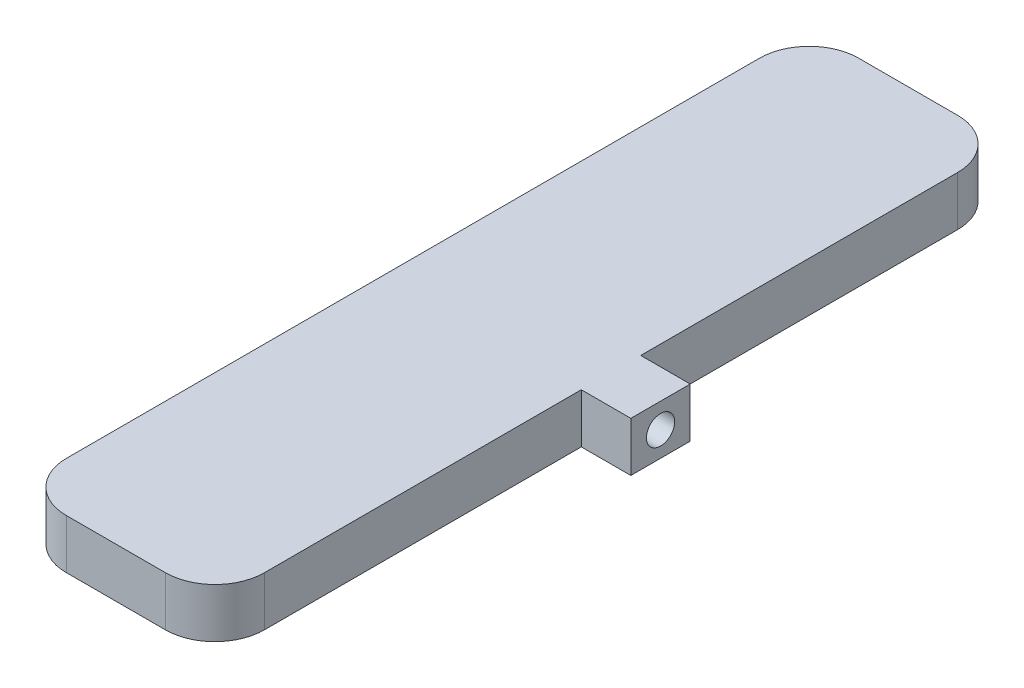
ISO-10303-21;
HEADER;
FILE_DESCRIPTION(('STEP AP214'),'2;1');
FILE_NAME('part.step','',(''),(''),'','','');
FILE_SCHEMA(('AUTOMOTIVE_DESIGN { 1 0 10303 214 1 1 1 1 }'));
ENDSEC;
DATA;
#1=APPLICATION_CONTEXT('core data for automotive mechanical design processes');
#2=APPLICATION_PROTOCOL_DEFINITION('international standard','automotive_design',2000,#1);
#3=PRODUCT_CONTEXT('',#1,'mechanical');
#4=PRODUCT('Part','Part','',(#3));
#5=PRODUCT_RELATED_PRODUCT_CATEGORY('part','',(#4));
#6=PRODUCT_DEFINITION_FORMATION('','',#4);
#7=PRODUCT_DEFINITION_CONTEXT('part definition',#1,'design');
#8=PRODUCT_DEFINITION('design','',#6,#7);
#9=PRODUCT_DEFINITION_SHAPE('','',#8);
#10=(LENGTH_UNIT() NAMED_UNIT(*) SI_UNIT(.MILLI.,.METRE.));
#11=(NAMED_UNIT(*) PLANE_ANGLE_UNIT() SI_UNIT($,.RADIAN.));
#12=(NAMED_UNIT(*) SI_UNIT($,.STERADIAN.) SOLID_ANGLE_UNIT());
#13=UNCERTAINTY_MEASURE_WITH_UNIT(LENGTH_MEASURE(1.E-05),#10,'distance_accuracy_value','');
#14=(GEOMETRIC_REPRESENTATION_CONTEXT(3) GLOBAL_UNCERTAINTY_ASSIGNED_CONTEXT((#13)) GLOBAL_UNIT_ASSIGNED_CONTEXT((#10,
#11,#12)) REPRESENTATION_CONTEXT('',''));
#15=CARTESIAN_POINT('',(0.,0.,0.));
#16=DIRECTION('',(0.,0.,1.));
#17=DIRECTION('',(1.,0.,0.));
#18=AXIS2_PLACEMENT_3D('',#15,#16,#17);
#19=CARTESIAN_POINT('',(9.99999999999999,5.,-40.));
#20=DIRECTION('',(-1.,0.,0.));
#21=DIRECTION('',(0.,0.,1.));
#22=AXIS2_PLACEMENT_3D('',#19,#20,#21);
#23=PLANE('',#22);
#24=DIRECTION('',(0.,-1.,0.));
#25=VECTOR('',#24,1.);
#26=CARTESIAN_POINT('',(10.,0.,3.));
#27=LINE('',#26,#25);
#28=CARTESIAN_POINT('',(10.,5.,3.));
#29=VERTEX_POINT('',#28);
#30=CARTESIAN_POINT('',(10.,0.,3.));
#31=VERTEX_POINT('',#30);
#32=EDGE_CURVE('E202',#29,#31,#27,.T.);
#33=ORIENTED_EDGE('',*,*,#32,.F.);
#34=DIRECTION('',(0.,0.,-1.));
#35=VECTOR('',#34,1.);
#36=CARTESIAN_POINT('',(9.99999999999999,5.,-40.));
#37=LINE('',#36,#35);
#38=CARTESIAN_POINT('',(10.,5.,35.));
#39=VERTEX_POINT('',#38);
#40=EDGE_CURVE('E263',#39,#29,#37,.T.);
#41=ORIENTED_EDGE('',*,*,#40,.F.);
#42=DIRECTION('',(0.,-1.,0.));
#43=VECTOR('',#42,1.);
#44=CARTESIAN_POINT('',(10.,5.,35.));
#45=LINE('',#44,#43);
#46=CARTESIAN_POINT('',(10.,0.,35.));
#47=VERTEX_POINT('',#46);
#48=EDGE_CURVE('E314',#39,#47,#45,.T.);
#49=ORIENTED_EDGE('',*,*,#48,.T.);
#50=DIRECTION('',(0.,0.,-1.));
#51=VECTOR('',#50,1.);
#52=CARTESIAN_POINT('',(9.99999999999999,0.,-40.));
#53=LINE('',#52,#51);
#54=EDGE_CURVE('E277',#47,#31,#53,.T.);
#55=ORIENTED_EDGE('',*,*,#54,.T.);
#56=EDGE_LOOP('',(#33,#41,#49,#55));
#57=FACE_BOUND('',#56,.T.);
#58=ADVANCED_FACE('F38',(#57),#23,.F.);
#59=DIRECTION('',(0.,1.,0.));
#60=VECTOR('',#59,1.);
#61=CARTESIAN_POINT('',(10.,0.,-3.));
#62=LINE('',#61,#60);
#63=CARTESIAN_POINT('',(10.,0.,-3.));
#64=VERTEX_POINT('',#63);
#65=CARTESIAN_POINT('',(10.,5.,-3.));
#66=VERTEX_POINT('',#65);
#67=EDGE_CURVE('E198',#64,#66,#62,.T.);
#68=ORIENTED_EDGE('',*,*,#67,.F.);
#69=CARTESIAN_POINT('',(9.99999999999999,0.,-35.));
#70=VERTEX_POINT('',#69);
#71=EDGE_CURVE('E249',#64,#70,#53,.T.);
#72=ORIENTED_EDGE('',*,*,#71,.T.);
#73=DIRECTION('',(0.,-1.,0.));
#74=VECTOR('',#73,1.);
#75=CARTESIAN_POINT('',(9.99999999999999,5.,-35.));
#76=LINE('',#75,#74);
#77=CARTESIAN_POINT('',(9.99999999999999,5.,-35.));
#78=VERTEX_POINT('',#77);
#79=EDGE_CURVE('E317',#70,#78,#76,.F.);
#80=ORIENTED_EDGE('',*,*,#79,.T.);
#81=EDGE_CURVE('E267',#66,#78,#37,.T.);
#82=ORIENTED_EDGE('',*,*,#81,.F.);
#83=EDGE_LOOP('',(#68,#72,#80,#82));
#84=FACE_BOUND('',#83,.T.);
#85=ADVANCED_FACE('F350',(#84),#23,.F.);
#86=CARTESIAN_POINT('',(0.,0.,0.));
#87=DIRECTION('',(0.,1.,0.));
#88=DIRECTION('',(0.,0.,1.));
#89=AXIS2_PLACEMENT_3D('',#86,#87,#88);
#90=PLANE('',#89);
#91=DIRECTION('',(0.,0.,1.));
#92=VECTOR('',#91,1.);
#93=CARTESIAN_POINT('',(-10.,0.,-40.));
#94=LINE('',#93,#92);
#95=CARTESIAN_POINT('',(-10.,0.,-35.));
#96=VERTEX_POINT('',#95);
#97=CARTESIAN_POINT('',(-9.99999999999999,0.,35.));
#98=VERTEX_POINT('',#97);
#99=EDGE_CURVE('E282',#96,#98,#94,.T.);
#100=ORIENTED_EDGE('',*,*,#99,.F.);
#101=CARTESIAN_POINT('',(-5.,0.,-35.));
#102=DIRECTION('',(0.,1.,0.));
#103=DIRECTION('',(0.,0.,1.));
#104=AXIS2_PLACEMENT_3D('',#101,#102,#103);
#105=CIRCLE('',#104,5.);
#106=CARTESIAN_POINT('',(-5.,0.,-40.));
#107=VERTEX_POINT('',#106);
#108=EDGE_CURVE('E299',#96,#107,#105,.F.);
#109=ORIENTED_EDGE('',*,*,#108,.T.);
#110=DIRECTION('',(-1.,0.,0.));
#111=VECTOR('',#110,1.);
#112=CARTESIAN_POINT('',(-10.,0.,-40.));
#113=LINE('',#112,#111);
#114=CARTESIAN_POINT('',(4.99999999999999,0.,-40.));
#115=VERTEX_POINT('',#114);
#116=EDGE_CURVE('E279',#115,#107,#113,.T.);
#117=ORIENTED_EDGE('',*,*,#116,.F.);
#118=CARTESIAN_POINT('',(4.99999999999999,0.,-35.));
#119=DIRECTION('',(0.,1.,0.));
#120=DIRECTION('',(0.,0.,1.));
#121=AXIS2_PLACEMENT_3D('',#118,#119,#120);
#122=CIRCLE('',#121,5.);
#123=EDGE_CURVE('E296',#115,#70,#122,.F.);
#124=ORIENTED_EDGE('',*,*,#123,.T.);
#125=ORIENTED_EDGE('',*,*,#71,.F.);
#126=DIRECTION('',(-1.,0.,0.));
#127=VECTOR('',#126,1.);
#128=CARTESIAN_POINT('',(15.,0.,-3.00000000000001));
#129=LINE('',#128,#127);
#130=CARTESIAN_POINT('',(15.,0.,-3.00000000000001));
#131=VERTEX_POINT('',#130);
#132=EDGE_CURVE('E187',#131,#64,#129,.T.);
#133=ORIENTED_EDGE('',*,*,#132,.F.);
#134=DIRECTION('',(0.,0.,-1.));
#135=VECTOR('',#134,1.);
#136=CARTESIAN_POINT('',(15.,0.,3.));
#137=LINE('',#136,#135);
#138=CARTESIAN_POINT('',(15.,0.,3.));
#139=VERTEX_POINT('',#138);
#140=EDGE_CURVE('E177',#139,#131,#137,.T.);
#141=ORIENTED_EDGE('',*,*,#140,.F.);
#142=DIRECTION('',(-1.,0.,0.));
#143=VECTOR('',#142,1.);
#144=CARTESIAN_POINT('',(15.,0.,3.));
#145=LINE('',#144,#143);
#146=EDGE_CURVE('E184',#139,#31,#145,.T.);
#147=ORIENTED_EDGE('',*,*,#146,.T.);
#148=ORIENTED_EDGE('',*,*,#54,.F.);
#149=CARTESIAN_POINT('',(5.00000000000001,0.,35.));
#150=DIRECTION('',(0.,1.,0.));
#151=DIRECTION('',(0.,0.,1.));
#152=AXIS2_PLACEMENT_3D('',#149,#150,#151);
#153=CIRCLE('',#152,5.);
#154=CARTESIAN_POINT('',(5.00000000000001,0.,40.));
#155=VERTEX_POINT('',#154);
#156=EDGE_CURVE('E292',#47,#155,#153,.F.);
#157=ORIENTED_EDGE('',*,*,#156,.T.);
#158=DIRECTION('',(1.,0.,0.));
#159=VECTOR('',#158,1.);
#160=CARTESIAN_POINT('',(-9.99999999999999,0.,40.));
#161=LINE('',#160,#159);
#162=CARTESIAN_POINT('',(-4.99999999999999,0.,40.));
#163=VERTEX_POINT('',#162);
#164=EDGE_CURVE('E285',#163,#155,#161,.T.);
#165=ORIENTED_EDGE('',*,*,#164,.F.);
#166=CARTESIAN_POINT('',(-4.99999999999999,0.,35.));
#167=DIRECTION('',(0.,1.,0.));
#168=DIRECTION('',(0.,0.,1.));
#169=AXIS2_PLACEMENT_3D('',#166,#167,#168);
#170=CIRCLE('',#169,5.);
#171=EDGE_CURVE('E294',#163,#98,#170,.F.);
#172=ORIENTED_EDGE('',*,*,#171,.T.);
#173=EDGE_LOOP('',(#100,#109,#117,#124,#125,#133,#141,#147,#148,#157,#165,#172));
#174=FACE_BOUND('',#173,.T.);
#175=CARTESIAN_POINT('',(-5.,0.,-35.));
#176=DIRECTION('',(0.,1.,0.));
#177=DIRECTION('',(0.,0.,1.));
#178=AXIS2_PLACEMENT_3D('',#175,#176,#177);
#179=CIRCLE('',#178,3.);
#180=CARTESIAN_POINT('',(-8.,0.,-35.));
#181=VERTEX_POINT('',#180);
#182=CARTESIAN_POINT('',(-5.,0.,-38.));
#183=VERTEX_POINT('',#182);
#184=EDGE_CURVE('E242',#181,#183,#179,.F.);
#185=ORIENTED_EDGE('',*,*,#184,.F.);
#186=DIRECTION('',(0.,0.,1.));
#187=VECTOR('',#186,1.);
#188=CARTESIAN_POINT('',(-8.00000000000001,0.,-40.));
#189=LINE('',#188,#187);
#190=CARTESIAN_POINT('',(-7.99999999999999,0.,35.));
#191=VERTEX_POINT('',#190);
#192=EDGE_CURVE('E254',#181,#191,#189,.T.);
#193=ORIENTED_EDGE('',*,*,#192,.T.);
#194=CARTESIAN_POINT('',(-4.99999999999999,0.,35.));
#195=DIRECTION('',(0.,1.,0.));
#196=DIRECTION('',(0.,0.,1.));
#197=AXIS2_PLACEMENT_3D('',#194,#195,#196);
#198=CIRCLE('',#197,3.);
#199=CARTESIAN_POINT('',(-4.99999999999999,0.,38.));
#200=VERTEX_POINT('',#199);
#201=EDGE_CURVE('E252',#200,#191,#198,.F.);
#202=ORIENTED_EDGE('',*,*,#201,.F.);
#203=DIRECTION('',(1.,0.,0.));
#204=VECTOR('',#203,1.);
#205=CARTESIAN_POINT('',(-9.99999999999999,0.,38.));
#206=LINE('',#205,#204);
#207=CARTESIAN_POINT('',(5.00000000000001,0.,38.));
#208=VERTEX_POINT('',#207);
#209=EDGE_CURVE('E61',#200,#208,#206,.T.);
#210=ORIENTED_EDGE('',*,*,#209,.T.);
#211=CARTESIAN_POINT('',(5.00000000000001,0.,35.));
#212=DIRECTION('',(0.,1.,0.));
#213=DIRECTION('',(0.,0.,1.));
#214=AXIS2_PLACEMENT_3D('',#211,#212,#213);
#215=CIRCLE('',#214,3.);
#216=CARTESIAN_POINT('',(8.00000000000001,0.,35.));
#217=VERTEX_POINT('',#216);
#218=EDGE_CURVE('E245',#217,#208,#215,.F.);
#219=ORIENTED_EDGE('',*,*,#218,.F.);
#220=DIRECTION('',(0.,0.,-1.));
#221=VECTOR('',#220,1.);
#222=CARTESIAN_POINT('',(7.99999999999999,0.,-40.));
#223=LINE('',#222,#221);
#224=CARTESIAN_POINT('',(7.99999999999999,0.,-35.));
#225=VERTEX_POINT('',#224);
#226=EDGE_CURVE('E204',#217,#225,#223,.T.);
#227=ORIENTED_EDGE('',*,*,#226,.T.);
#228=CARTESIAN_POINT('',(4.99999999999999,0.,-35.));
#229=DIRECTION('',(0.,1.,0.));
#230=DIRECTION('',(0.,0.,1.));
#231=AXIS2_PLACEMENT_3D('',#228,#229,#230);
#232=CIRCLE('',#231,3.);
#233=CARTESIAN_POINT('',(4.99999999999999,0.,-38.));
#234=VERTEX_POINT('',#233);
#235=EDGE_CURVE('E256',#234,#225,#232,.F.);
#236=ORIENTED_EDGE('',*,*,#235,.F.);
#237=DIRECTION('',(-1.,0.,0.));
#238=VECTOR('',#237,1.);
#239=CARTESIAN_POINT('',(-10.,0.,-38.));
#240=LINE('',#239,#238);
#241=EDGE_CURVE('E207',#234,#183,#240,.T.);
#242=ORIENTED_EDGE('',*,*,#241,.T.);
#243=EDGE_LOOP('',(#185,#193,#202,#210,#219,#227,#236,#242));
#244=FACE_BOUND('',#243,.T.);
#245=ADVANCED_FACE('F180',(#174,#244),#90,.F.);
#246=CARTESIAN_POINT('',(-10.,5.,-40.));
#247=DIRECTION('',(0.,0.,1.));
#248=DIRECTION('',(1.,0.,0.));
#249=AXIS2_PLACEMENT_3D('',#246,#247,#248);
#250=PLANE('',#249);
#251=ORIENTED_EDGE('',*,*,#116,.T.);
#252=DIRECTION('',(0.,-1.,0.));
#253=VECTOR('',#252,1.);
#254=CARTESIAN_POINT('',(-5.,5.,-40.));
#255=LINE('',#254,#253);
#256=CARTESIAN_POINT('',(-5.,5.,-40.));
#257=VERTEX_POINT('',#256);
#258=EDGE_CURVE('E304',#107,#257,#255,.F.);
#259=ORIENTED_EDGE('',*,*,#258,.T.);
#260=DIRECTION('',(-1.,0.,0.));
#261=VECTOR('',#260,1.);
#262=CARTESIAN_POINT('',(-10.,5.,-40.));
#263=LINE('',#262,#261);
#264=CARTESIAN_POINT('',(4.99999999999999,5.,-40.));
#265=VERTEX_POINT('',#264);
#266=EDGE_CURVE('E266',#265,#257,#263,.T.);
#267=ORIENTED_EDGE('',*,*,#266,.F.);
#268=DIRECTION('',(0.,-1.,0.));
#269=VECTOR('',#268,1.);
#270=CARTESIAN_POINT('',(4.99999999999999,5.,-40.));
#271=LINE('',#270,#269);
#272=EDGE_CURVE('E301',#265,#115,#271,.T.);
#273=ORIENTED_EDGE('',*,*,#272,.T.);
#274=EDGE_LOOP('',(#251,#259,#267,#273));
#275=FACE_BOUND('',#274,.T.);
#276=ADVANCED_FACE('F358',(#275),#250,.F.);
#277=CARTESIAN_POINT('',(-10.,5.,-40.));
#278=DIRECTION('',(1.,0.,0.));
#279=DIRECTION('',(0.,0.,-1.));
#280=AXIS2_PLACEMENT_3D('',#277,#278,#279);
#281=PLANE('',#280);
#282=DIRECTION('',(0.,0.,1.));
#283=VECTOR('',#282,1.);
#284=CARTESIAN_POINT('',(-10.,5.,-40.));
#285=LINE('',#284,#283);
#286=CARTESIAN_POINT('',(-10.,5.,-35.));
#287=VERTEX_POINT('',#286);
#288=CARTESIAN_POINT('',(-9.99999999999999,5.,35.));
#289=VERTEX_POINT('',#288);
#290=EDGE_CURVE('E270',#287,#289,#285,.T.);
#291=ORIENTED_EDGE('',*,*,#290,.F.);
#292=DIRECTION('',(0.,-1.,0.));
#293=VECTOR('',#292,1.);
#294=CARTESIAN_POINT('',(-10.,5.,-35.));
#295=LINE('',#294,#293);
#296=EDGE_CURVE('E289',#287,#96,#295,.T.);
#297=ORIENTED_EDGE('',*,*,#296,.T.);
#298=ORIENTED_EDGE('',*,*,#99,.T.);
#299=DIRECTION('',(0.,-1.,0.));
#300=VECTOR('',#299,1.);
#301=CARTESIAN_POINT('',(-9.99999999999999,5.,35.));
#302=LINE('',#301,#300);
#303=EDGE_CURVE('E276',#98,#289,#302,.F.);
#304=ORIENTED_EDGE('',*,*,#303,.T.);
#305=EDGE_LOOP('',(#291,#297,#298,#304));
#306=FACE_BOUND('',#305,.T.);
#307=ADVANCED_FACE('F336',(#306),#281,.F.);
#308=CARTESIAN_POINT('',(-9.99999999999999,5.,40.));
#309=DIRECTION('',(0.,0.,-1.));
#310=DIRECTION('',(-1.,0.,0.));
#311=AXIS2_PLACEMENT_3D('',#308,#309,#310);
#312=PLANE('',#311);
#313=DIRECTION('',(1.,0.,0.));
#314=VECTOR('',#313,1.);
#315=CARTESIAN_POINT('',(-9.99999999999999,5.,40.));
#316=LINE('',#315,#314);
#317=CARTESIAN_POINT('',(-4.99999999999999,5.,40.));
#318=VERTEX_POINT('',#317);
#319=CARTESIAN_POINT('',(5.00000000000001,5.,40.));
#320=VERTEX_POINT('',#319);
#321=EDGE_CURVE('E273',#318,#320,#316,.T.);
#322=ORIENTED_EDGE('',*,*,#321,.F.);
#323=DIRECTION('',(0.,-1.,0.));
#324=VECTOR('',#323,1.);
#325=CARTESIAN_POINT('',(-4.99999999999999,5.,40.));
#326=LINE('',#325,#324);
#327=EDGE_CURVE('E11',#318,#163,#326,.T.);
#328=ORIENTED_EDGE('',*,*,#327,.T.);
#329=ORIENTED_EDGE('',*,*,#164,.T.);
#330=DIRECTION('',(0.,-1.,0.));
#331=VECTOR('',#330,1.);
#332=CARTESIAN_POINT('',(5.00000000000001,5.,40.));
#333=LINE('',#332,#331);
#334=EDGE_CURVE('E46',#155,#320,#333,.F.);
#335=ORIENTED_EDGE('',*,*,#334,.T.);
#336=EDGE_LOOP('',(#322,#328,#329,#335));
#337=FACE_BOUND('',#336,.T.);
#338=ADVANCED_FACE('F322',(#337),#312,.F.);
#339=CARTESIAN_POINT('',(0.,5.,0.));
#340=DIRECTION('',(0.,1.,0.));
#341=DIRECTION('',(0.,0.,1.));
#342=AXIS2_PLACEMENT_3D('',#339,#340,#341);
#343=PLANE('',#342);
#344=ORIENTED_EDGE('',*,*,#266,.T.);
#345=CARTESIAN_POINT('',(-5.,5.,-35.));
#346=DIRECTION('',(0.,1.,0.));
#347=DIRECTION('',(0.,0.,1.));
#348=AXIS2_PLACEMENT_3D('',#345,#346,#347);
#349=CIRCLE('',#348,5.);
#350=EDGE_CURVE('E312',#257,#287,#349,.T.);
#351=ORIENTED_EDGE('',*,*,#350,.T.);
#352=ORIENTED_EDGE('',*,*,#290,.T.);
#353=CARTESIAN_POINT('',(-4.99999999999999,5.,35.));
#354=DIRECTION('',(0.,1.,0.));
#355=DIRECTION('',(0.,0.,1.));
#356=AXIS2_PLACEMENT_3D('',#353,#354,#355);
#357=CIRCLE('',#356,5.);
#358=EDGE_CURVE('E308',#289,#318,#357,.T.);
#359=ORIENTED_EDGE('',*,*,#358,.T.);
#360=ORIENTED_EDGE('',*,*,#321,.T.);
#361=CARTESIAN_POINT('',(5.00000000000001,5.,35.));
#362=DIRECTION('',(0.,1.,0.));
#363=DIRECTION('',(0.,0.,1.));
#364=AXIS2_PLACEMENT_3D('',#361,#362,#363);
#365=CIRCLE('',#364,5.);
#366=EDGE_CURVE('E306',#320,#39,#365,.T.);
#367=ORIENTED_EDGE('',*,*,#366,.T.);
#368=ORIENTED_EDGE('',*,*,#40,.T.);
#369=DIRECTION('',(-1.,0.,0.));
#370=VECTOR('',#369,1.);
#371=CARTESIAN_POINT('',(15.,5.,3.));
#372=LINE('',#371,#370);
#373=CARTESIAN_POINT('',(15.,5.,3.));
#374=VERTEX_POINT('',#373);
#375=EDGE_CURVE('E382',#374,#29,#372,.T.);
#376=ORIENTED_EDGE('',*,*,#375,.F.);
#377=DIRECTION('',(0.,0.,1.));
#378=VECTOR('',#377,1.);
#379=CARTESIAN_POINT('',(15.,5.,3.));
#380=LINE('',#379,#378);
#381=CARTESIAN_POINT('',(15.,5.,-3.));
#382=VERTEX_POINT('',#381);
#383=EDGE_CURVE('E195',#382,#374,#380,.T.);
#384=ORIENTED_EDGE('',*,*,#383,.F.);
#385=DIRECTION('',(-1.,0.,0.));
#386=VECTOR('',#385,1.);
#387=CARTESIAN_POINT('',(15.,5.,-3.));
#388=LINE('',#387,#386);
#389=EDGE_CURVE('E53',#382,#66,#388,.T.);
#390=ORIENTED_EDGE('',*,*,#389,.T.);
#391=ORIENTED_EDGE('',*,*,#81,.T.);
#392=CARTESIAN_POINT('',(4.99999999999999,5.,-35.));
#393=DIRECTION('',(0.,1.,0.));
#394=DIRECTION('',(0.,0.,1.));
#395=AXIS2_PLACEMENT_3D('',#392,#393,#394);
#396=CIRCLE('',#395,5.);
#397=EDGE_CURVE('E310',#78,#265,#396,.T.);
#398=ORIENTED_EDGE('',*,*,#397,.T.);
#399=EDGE_LOOP('',(#344,#351,#352,#359,#360,#367,#368,#376,#384,#390,#391,#398));
#400=FACE_BOUND('',#399,.T.);
#401=ADVANCED_FACE('F327',(#400),#343,.T.);
#402=CARTESIAN_POINT('',(-5.,5.,-35.));
#403=DIRECTION('',(0.,-1.,0.));
#404=DIRECTION('',(0.,0.,-1.));
#405=AXIS2_PLACEMENT_3D('',#402,#403,#404);
#406=CYLINDRICAL_SURFACE('',#405,5.);
#407=ORIENTED_EDGE('',*,*,#350,.F.);
#408=ORIENTED_EDGE('',*,*,#258,.F.);
#409=ORIENTED_EDGE('',*,*,#108,.F.);
#410=ORIENTED_EDGE('',*,*,#296,.F.);
#411=EDGE_LOOP('',(#407,#408,#409,#410));
#412=FACE_BOUND('',#411,.T.);
#413=ADVANCED_FACE('F346',(#412),#406,.T.);
#414=CARTESIAN_POINT('',(4.99999999999999,5.,-35.));
#415=DIRECTION('',(0.,-1.,0.));
#416=DIRECTION('',(0.,0.,-1.));
#417=AXIS2_PLACEMENT_3D('',#414,#415,#416);
#418=CYLINDRICAL_SURFACE('',#417,5.);
#419=ORIENTED_EDGE('',*,*,#397,.F.);
#420=ORIENTED_EDGE('',*,*,#79,.F.);
#421=ORIENTED_EDGE('',*,*,#123,.F.);
#422=ORIENTED_EDGE('',*,*,#272,.F.);
#423=EDGE_LOOP('',(#419,#420,#421,#422));
#424=FACE_BOUND('',#423,.T.);
#425=ADVANCED_FACE('F340',(#424),#418,.T.);
#426=CARTESIAN_POINT('',(-4.99999999999999,5.,35.));
#427=DIRECTION('',(0.,-1.,0.));
#428=DIRECTION('',(0.,0.,-1.));
#429=AXIS2_PLACEMENT_3D('',#426,#427,#428);
#430=CYLINDRICAL_SURFACE('',#429,5.);
#431=ORIENTED_EDGE('',*,*,#358,.F.);
#432=ORIENTED_EDGE('',*,*,#303,.F.);
#433=ORIENTED_EDGE('',*,*,#171,.F.);
#434=ORIENTED_EDGE('',*,*,#327,.F.);
#435=EDGE_LOOP('',(#431,#432,#433,#434));
#436=FACE_BOUND('',#435,.T.);
#437=ADVANCED_FACE('F338',(#436),#430,.T.);
#438=CARTESIAN_POINT('',(5.00000000000001,5.,35.));
#439=DIRECTION('',(0.,-1.,0.));
#440=DIRECTION('',(0.,0.,-1.));
#441=AXIS2_PLACEMENT_3D('',#438,#439,#440);
#442=CYLINDRICAL_SURFACE('',#441,5.);
#443=ORIENTED_EDGE('',*,*,#366,.F.);
#444=ORIENTED_EDGE('',*,*,#334,.F.);
#445=ORIENTED_EDGE('',*,*,#156,.F.);
#446=ORIENTED_EDGE('',*,*,#48,.F.);
#447=EDGE_LOOP('',(#443,#444,#445,#446));
#448=FACE_BOUND('',#447,.T.);
#449=ADVANCED_FACE('F40',(#448),#442,.T.);
#450=CARTESIAN_POINT('',(7.99999999999999,5.,-40.));
#451=DIRECTION('',(-1.,0.,0.));
#452=DIRECTION('',(0.,0.,1.));
#453=AXIS2_PLACEMENT_3D('',#450,#451,#452);
#454=PLANE('',#453);
#455=ORIENTED_EDGE('',*,*,#226,.F.);
#456=DIRECTION('',(0.,1.,0.));
#457=VECTOR('',#456,1.);
#458=CARTESIAN_POINT('',(8.00000000000001,5.,35.));
#459=LINE('',#458,#457);
#460=CARTESIAN_POINT('',(8.00000000000001,3.,35.));
#461=VERTEX_POINT('',#460);
#462=EDGE_CURVE('E215',#461,#217,#459,.F.);
#463=ORIENTED_EDGE('',*,*,#462,.F.);
#464=DIRECTION('',(0.,0.,-1.));
#465=VECTOR('',#464,1.);
#466=CARTESIAN_POINT('',(7.99999999999999,3.,-40.));
#467=LINE('',#466,#465);
#468=CARTESIAN_POINT('',(7.99999999999999,3.,-35.));
#469=VERTEX_POINT('',#468);
#470=EDGE_CURVE('E216',#461,#469,#467,.T.);
#471=ORIENTED_EDGE('',*,*,#470,.T.);
#472=DIRECTION('',(0.,1.,0.));
#473=VECTOR('',#472,1.);
#474=CARTESIAN_POINT('',(7.99999999999999,5.,-35.));
#475=LINE('',#474,#473);
#476=EDGE_CURVE('E212',#225,#469,#475,.T.);
#477=ORIENTED_EDGE('',*,*,#476,.F.);
#478=EDGE_LOOP('',(#455,#463,#471,#477));
#479=FACE_BOUND('',#478,.T.);
#480=ADVANCED_FACE('F345',(#479),#454,.T.);
#481=CARTESIAN_POINT('',(-10.,5.,-38.));
#482=DIRECTION('',(0.,0.,1.));
#483=DIRECTION('',(1.,0.,0.));
#484=AXIS2_PLACEMENT_3D('',#481,#482,#483);
#485=PLANE('',#484);
#486=ORIENTED_EDGE('',*,*,#241,.F.);
#487=DIRECTION('',(0.,1.,0.));
#488=VECTOR('',#487,1.);
#489=CARTESIAN_POINT('',(4.99999999999999,5.,-38.));
#490=LINE('',#489,#488);
#491=CARTESIAN_POINT('',(4.99999999999999,3.,-38.));
#492=VERTEX_POINT('',#491);
#493=EDGE_CURVE('E240',#492,#234,#490,.F.);
#494=ORIENTED_EDGE('',*,*,#493,.F.);
#495=DIRECTION('',(-1.,0.,0.));
#496=VECTOR('',#495,1.);
#497=CARTESIAN_POINT('',(-10.,3.,-38.));
#498=LINE('',#497,#496);
#499=CARTESIAN_POINT('',(-5.,3.,-38.));
#500=VERTEX_POINT('',#499);
#501=EDGE_CURVE('E219',#492,#500,#498,.T.);
#502=ORIENTED_EDGE('',*,*,#501,.T.);
#503=DIRECTION('',(0.,1.,0.));
#504=VECTOR('',#503,1.);
#505=CARTESIAN_POINT('',(-5.,5.,-38.));
#506=LINE('',#505,#504);
#507=EDGE_CURVE('E237',#183,#500,#506,.T.);
#508=ORIENTED_EDGE('',*,*,#507,.F.);
#509=EDGE_LOOP('',(#486,#494,#502,#508));
#510=FACE_BOUND('',#509,.T.);
#511=ADVANCED_FACE('F413',(#510),#485,.T.);
#512=CARTESIAN_POINT('',(-8.00000000000001,5.,-40.));
#513=DIRECTION('',(1.,0.,0.));
#514=DIRECTION('',(0.,0.,-1.));
#515=AXIS2_PLACEMENT_3D('',#512,#513,#514);
#516=PLANE('',#515);
#517=DIRECTION('',(0.,0.,1.));
#518=VECTOR('',#517,1.);
#519=CARTESIAN_POINT('',(-8.00000000000001,3.,-40.));
#520=LINE('',#519,#518);
#521=CARTESIAN_POINT('',(-8.00000000000001,3.,-35.));
#522=VERTEX_POINT('',#521);
#523=CARTESIAN_POINT('',(-7.99999999999999,3.,35.));
#524=VERTEX_POINT('',#523);
#525=EDGE_CURVE('E224',#522,#524,#520,.T.);
#526=ORIENTED_EDGE('',*,*,#525,.T.);
#527=DIRECTION('',(0.,1.,0.));
#528=VECTOR('',#527,1.);
#529=CARTESIAN_POINT('',(-7.99999999999999,5.,35.));
#530=LINE('',#529,#528);
#531=EDGE_CURVE('E235',#191,#524,#530,.T.);
#532=ORIENTED_EDGE('',*,*,#531,.F.);
#533=ORIENTED_EDGE('',*,*,#192,.F.);
#534=DIRECTION('',(0.,1.,0.));
#535=VECTOR('',#534,1.);
#536=CARTESIAN_POINT('',(-8.00000000000001,5.,-35.));
#537=LINE('',#536,#535);
#538=EDGE_CURVE('E243',#522,#181,#537,.F.);
#539=ORIENTED_EDGE('',*,*,#538,.F.);
#540=EDGE_LOOP('',(#526,#532,#533,#539));
#541=FACE_BOUND('',#540,.T.);
#542=ADVANCED_FACE('F417',(#541),#516,.T.);
#543=CARTESIAN_POINT('',(-9.99999999999999,5.,38.));
#544=DIRECTION('',(0.,0.,-1.));
#545=DIRECTION('',(-1.,0.,0.));
#546=AXIS2_PLACEMENT_3D('',#543,#544,#545);
#547=PLANE('',#546);
#548=DIRECTION('',(1.,0.,0.));
#549=VECTOR('',#548,1.);
#550=CARTESIAN_POINT('',(-9.99999999999999,3.,38.));
#551=LINE('',#550,#549);
#552=CARTESIAN_POINT('',(-4.99999999999999,3.,38.));
#553=VERTEX_POINT('',#552);
#554=CARTESIAN_POINT('',(5.00000000000001,3.,38.));
#555=VERTEX_POINT('',#554);
#556=EDGE_CURVE('E229',#553,#555,#551,.T.);
#557=ORIENTED_EDGE('',*,*,#556,.T.);
#558=DIRECTION('',(0.,1.,0.));
#559=VECTOR('',#558,1.);
#560=CARTESIAN_POINT('',(5.00000000000001,5.,38.));
#561=LINE('',#560,#559);
#562=EDGE_CURVE('E214',#208,#555,#561,.T.);
#563=ORIENTED_EDGE('',*,*,#562,.F.);
#564=ORIENTED_EDGE('',*,*,#209,.F.);
#565=DIRECTION('',(0.,1.,0.));
#566=VECTOR('',#565,1.);
#567=CARTESIAN_POINT('',(-4.99999999999999,5.,38.));
#568=LINE('',#567,#566);
#569=EDGE_CURVE('E247',#553,#200,#568,.F.);
#570=ORIENTED_EDGE('',*,*,#569,.F.);
#571=EDGE_LOOP('',(#557,#563,#564,#570));
#572=FACE_BOUND('',#571,.T.);
#573=ADVANCED_FACE('F421',(#572),#547,.T.);
#574=CARTESIAN_POINT('',(0.,3.,0.));
#575=DIRECTION('',(0.,1.,0.));
#576=DIRECTION('',(0.,0.,1.));
#577=AXIS2_PLACEMENT_3D('',#574,#575,#576);
#578=PLANE('',#577);
#579=ORIENTED_EDGE('',*,*,#501,.F.);
#580=CARTESIAN_POINT('',(4.99999999999999,3.,-35.));
#581=DIRECTION('',(0.,1.,0.));
#582=DIRECTION('',(0.,0.,1.));
#583=AXIS2_PLACEMENT_3D('',#580,#581,#582);
#584=CIRCLE('',#583,3.);
#585=EDGE_CURVE('E226',#469,#492,#584,.T.);
#586=ORIENTED_EDGE('',*,*,#585,.F.);
#587=ORIENTED_EDGE('',*,*,#470,.F.);
#588=CARTESIAN_POINT('',(5.00000000000001,3.,35.));
#589=DIRECTION('',(0.,1.,0.));
#590=DIRECTION('',(0.,0.,1.));
#591=AXIS2_PLACEMENT_3D('',#588,#589,#590);
#592=CIRCLE('',#591,3.);
#593=EDGE_CURVE('E232',#555,#461,#592,.T.);
#594=ORIENTED_EDGE('',*,*,#593,.F.);
#595=ORIENTED_EDGE('',*,*,#556,.F.);
#596=CARTESIAN_POINT('',(-4.99999999999999,3.,35.));
#597=DIRECTION('',(0.,1.,0.));
#598=DIRECTION('',(0.,0.,1.));
#599=AXIS2_PLACEMENT_3D('',#596,#597,#598);
#600=CIRCLE('',#599,3.);
#601=EDGE_CURVE('E230',#524,#553,#600,.T.);
#602=ORIENTED_EDGE('',*,*,#601,.F.);
#603=ORIENTED_EDGE('',*,*,#525,.F.);
#604=CARTESIAN_POINT('',(-5.,3.,-35.));
#605=DIRECTION('',(0.,1.,0.));
#606=DIRECTION('',(0.,0.,1.));
#607=AXIS2_PLACEMENT_3D('',#604,#605,#606);
#608=CIRCLE('',#607,3.);
#609=EDGE_CURVE('E221',#500,#522,#608,.T.);
#610=ORIENTED_EDGE('',*,*,#609,.F.);
#611=EDGE_LOOP('',(#579,#586,#587,#594,#595,#602,#603,#610));
#612=FACE_BOUND('',#611,.T.);
#613=ADVANCED_FACE('F425',(#612),#578,.F.);
#614=CARTESIAN_POINT('',(-5.,5.,-35.));
#615=DIRECTION('',(0.,-1.,0.));
#616=DIRECTION('',(0.,0.,-1.));
#617=AXIS2_PLACEMENT_3D('',#614,#615,#616);
#618=CYLINDRICAL_SURFACE('',#617,3.);
#619=ORIENTED_EDGE('',*,*,#609,.T.);
#620=ORIENTED_EDGE('',*,*,#538,.T.);
#621=ORIENTED_EDGE('',*,*,#184,.T.);
#622=ORIENTED_EDGE('',*,*,#507,.T.);
#623=EDGE_LOOP('',(#619,#620,#621,#622));
#624=FACE_BOUND('',#623,.T.);
#625=ADVANCED_FACE('F428',(#624),#618,.F.);
#626=CARTESIAN_POINT('',(4.99999999999999,5.,-35.));
#627=DIRECTION('',(0.,-1.,0.));
#628=DIRECTION('',(0.,0.,-1.));
#629=AXIS2_PLACEMENT_3D('',#626,#627,#628);
#630=CYLINDRICAL_SURFACE('',#629,3.);
#631=ORIENTED_EDGE('',*,*,#585,.T.);
#632=ORIENTED_EDGE('',*,*,#493,.T.);
#633=ORIENTED_EDGE('',*,*,#235,.T.);
#634=ORIENTED_EDGE('',*,*,#476,.T.);
#635=EDGE_LOOP('',(#631,#632,#633,#634));
#636=FACE_BOUND('',#635,.T.);
#637=ADVANCED_FACE('F432',(#636),#630,.F.);
#638=CARTESIAN_POINT('',(-4.99999999999999,5.,35.));
#639=DIRECTION('',(0.,-1.,0.));
#640=DIRECTION('',(0.,0.,-1.));
#641=AXIS2_PLACEMENT_3D('',#638,#639,#640);
#642=CYLINDRICAL_SURFACE('',#641,3.);
#643=ORIENTED_EDGE('',*,*,#601,.T.);
#644=ORIENTED_EDGE('',*,*,#569,.T.);
#645=ORIENTED_EDGE('',*,*,#201,.T.);
#646=ORIENTED_EDGE('',*,*,#531,.T.);
#647=EDGE_LOOP('',(#643,#644,#645,#646));
#648=FACE_BOUND('',#647,.T.);
#649=ADVANCED_FACE('F436',(#648),#642,.F.);
#650=CARTESIAN_POINT('',(5.00000000000001,5.,35.));
#651=DIRECTION('',(0.,-1.,0.));
#652=DIRECTION('',(0.,0.,-1.));
#653=AXIS2_PLACEMENT_3D('',#650,#651,#652);
#654=CYLINDRICAL_SURFACE('',#653,3.);
#655=ORIENTED_EDGE('',*,*,#593,.T.);
#656=ORIENTED_EDGE('',*,*,#462,.T.);
#657=ORIENTED_EDGE('',*,*,#218,.T.);
#658=ORIENTED_EDGE('',*,*,#562,.T.);
#659=EDGE_LOOP('',(#655,#656,#657,#658));
#660=FACE_BOUND('',#659,.T.);
#661=ADVANCED_FACE('F410',(#660),#654,.F.);
#662=CARTESIAN_POINT('',(15.,0.,3.));
#663=DIRECTION('',(0.,0.,-1.));
#664=DIRECTION('',(0.,1.,0.));
#665=AXIS2_PLACEMENT_3D('',#662,#663,#664);
#666=PLANE('',#665);
#667=ORIENTED_EDGE('',*,*,#32,.T.);
#668=ORIENTED_EDGE('',*,*,#146,.F.);
#669=DIRECTION('',(0.,-1.,0.));
#670=VECTOR('',#669,1.);
#671=CARTESIAN_POINT('',(15.,0.,3.));
#672=LINE('',#671,#670);
#673=EDGE_CURVE('E191',#374,#139,#672,.T.);
#674=ORIENTED_EDGE('',*,*,#673,.F.);
#675=ORIENTED_EDGE('',*,*,#375,.T.);
#676=EDGE_LOOP('',(#667,#668,#674,#675));
#677=FACE_BOUND('',#676,.T.);
#678=ADVANCED_FACE('F200',(#677),#666,.F.);
#679=CARTESIAN_POINT('',(15.,0.,-3.00000000000001));
#680=DIRECTION('',(0.,0.,1.));
#681=DIRECTION('',(0.,-1.,0.));
#682=AXIS2_PLACEMENT_3D('',#679,#680,#681);
#683=PLANE('',#682);
#684=ORIENTED_EDGE('',*,*,#67,.T.);
#685=ORIENTED_EDGE('',*,*,#389,.F.);
#686=DIRECTION('',(0.,1.,0.));
#687=VECTOR('',#686,1.);
#688=CARTESIAN_POINT('',(15.,0.,-3.00000000000001));
#689=LINE('',#688,#687);
#690=EDGE_CURVE('E190',#131,#382,#689,.T.);
#691=ORIENTED_EDGE('',*,*,#690,.F.);
#692=ORIENTED_EDGE('',*,*,#132,.T.);
#693=EDGE_LOOP('',(#684,#685,#691,#692));
#694=FACE_BOUND('',#693,.T.);
#695=ADVANCED_FACE('F400',(#694),#683,.F.);
#696=CARTESIAN_POINT('',(15.,0.,0.));
#697=DIRECTION('',(-1.,0.,0.));
#698=DIRECTION('',(0.,0.,1.));
#699=AXIS2_PLACEMENT_3D('',#696,#697,#698);
#700=PLANE('',#699);
#701=CARTESIAN_POINT('',(15.,2.5,0.));
#702=DIRECTION('',(1.,0.,0.));
#703=DIRECTION('',(0.,0.,-1.));
#704=AXIS2_PLACEMENT_3D('',#701,#702,#703);
#705=CIRCLE('',#704,1.425);
#706=CARTESIAN_POINT('',(15.,2.5,-1.425));
#707=VERTEX_POINT('',#706);
#708=EDGE_CURVE('E385',#707,#707,#705,.T.);
#709=ORIENTED_EDGE('',*,*,#708,.F.);
#710=EDGE_LOOP('',(#709));
#711=FACE_BOUND('',#710,.T.);
#712=ORIENTED_EDGE('',*,*,#673,.T.);
#713=ORIENTED_EDGE('',*,*,#140,.T.);
#714=ORIENTED_EDGE('',*,*,#690,.T.);
#715=ORIENTED_EDGE('',*,*,#383,.T.);
#716=EDGE_LOOP('',(#712,#713,#714,#715));
#717=FACE_BOUND('',#716,.T.);
#718=ADVANCED_FACE('F194',(#711,#717),#700,.F.);
#719=CARTESIAN_POINT('',(11.,2.5,0.));
#720=DIRECTION('',(1.,0.,0.));
#721=DIRECTION('',(0.,0.,-1.));
#722=AXIS2_PLACEMENT_3D('',#719,#720,#721);
#723=CYLINDRICAL_SURFACE('',#722,1.425);
#724=CARTESIAN_POINT('',(11.,2.5,0.));
#725=DIRECTION('',(1.,0.,0.));
#726=DIRECTION('',(0.,0.,-1.));
#727=AXIS2_PLACEMENT_3D('',#724,#725,#726);
#728=CIRCLE('',#727,1.425);
#729=CARTESIAN_POINT('',(11.,2.5,-1.425));
#730=VERTEX_POINT('',#729);
#731=EDGE_CURVE('E378',#730,#730,#728,.T.);
#732=ORIENTED_EDGE('',*,*,#731,.F.);
#733=EDGE_LOOP('',(#732));
#734=FACE_BOUND('',#733,.T.);
#735=ORIENTED_EDGE('',*,*,#708,.T.);
#736=EDGE_LOOP('',(#735));
#737=FACE_BOUND('',#736,.T.);
#738=ADVANCED_FACE('F393',(#734,#737),#723,.F.);
#739=CARTESIAN_POINT('',(11.,2.5,0.));
#740=DIRECTION('',(1.,0.,0.));
#741=DIRECTION('',(0.,0.,-1.));
#742=AXIS2_PLACEMENT_3D('',#739,#740,#741);
#743=PLANE('',#742);
#744=ORIENTED_EDGE('',*,*,#731,.T.);
#745=EDGE_LOOP('',(#744));
#746=FACE_BOUND('',#745,.T.);
#747=ADVANCED_FACE('F391',(#746),#743,.T.);
#748=CLOSED_SHELL('',(#58,#85,#245,#276,#307,#338,#401,#413,#425,#437,#449,#480,#511,#542,#573,
#613,#625,#637,#649,#661,#678,#695,#718,#738,#747));
#749=MANIFOLD_SOLID_BREP('B2',#748);
#750=ADVANCED_BREP_SHAPE_REPRESENTATION('',(#18,#749),#14);
#751=SHAPE_DEFINITION_REPRESENTATION(#9,#750);
ENDSEC;
END-ISO-10303-21;
